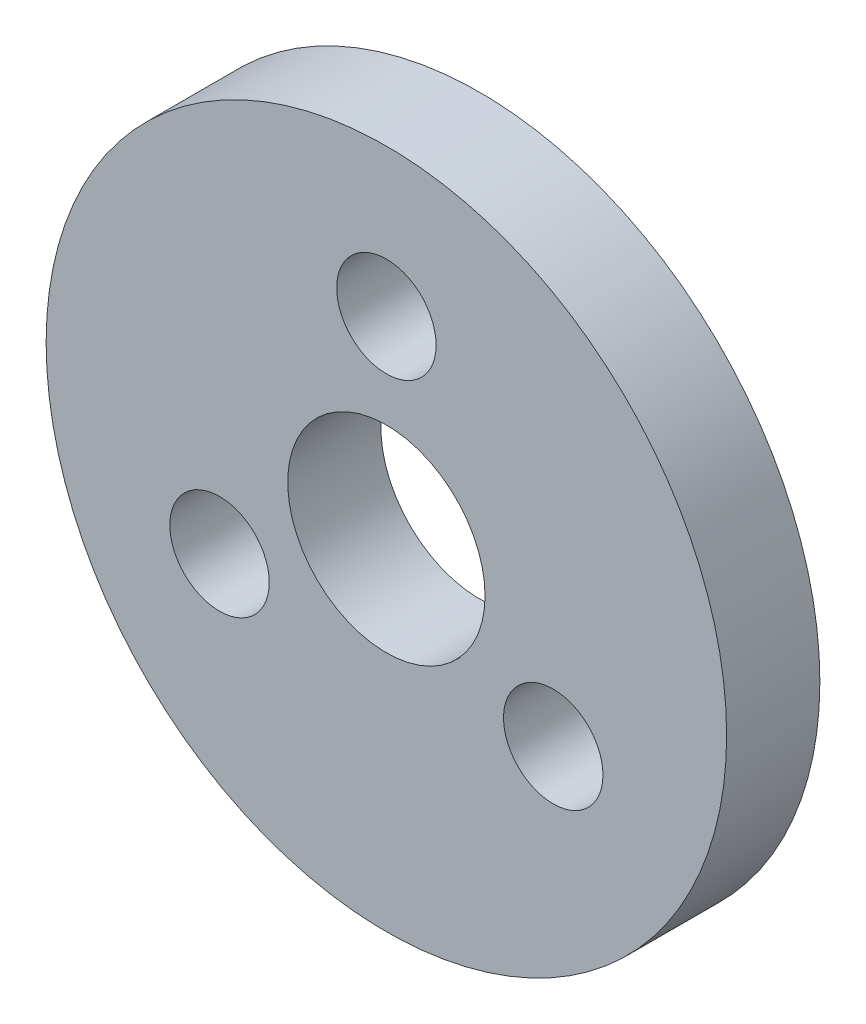
ISO-10303-21;
HEADER;
FILE_DESCRIPTION(('STEP AP214'),'2;1');
FILE_NAME('part.step','',(''),(''),'','','');
FILE_SCHEMA(('AUTOMOTIVE_DESIGN { 1 0 10303 214 1 1 1 1 }'));
ENDSEC;
DATA;
#1=APPLICATION_CONTEXT('core data for automotive mechanical design processes');
#2=APPLICATION_PROTOCOL_DEFINITION('international standard','automotive_design',2000,#1);
#3=PRODUCT_CONTEXT('',#1,'mechanical');
#4=PRODUCT('Part','Part','',(#3));
#5=PRODUCT_RELATED_PRODUCT_CATEGORY('part','',(#4));
#6=PRODUCT_DEFINITION_FORMATION('','',#4);
#7=PRODUCT_DEFINITION_CONTEXT('part definition',#1,'design');
#8=PRODUCT_DEFINITION('design','',#6,#7);
#9=PRODUCT_DEFINITION_SHAPE('','',#8);
#10=(LENGTH_UNIT() NAMED_UNIT(*) SI_UNIT(.MILLI.,.METRE.));
#11=(NAMED_UNIT(*) PLANE_ANGLE_UNIT() SI_UNIT($,.RADIAN.));
#12=(NAMED_UNIT(*) SI_UNIT($,.STERADIAN.) SOLID_ANGLE_UNIT());
#13=UNCERTAINTY_MEASURE_WITH_UNIT(LENGTH_MEASURE(1.E-05),#10,'distance_accuracy_value','');
#14=(GEOMETRIC_REPRESENTATION_CONTEXT(3) GLOBAL_UNCERTAINTY_ASSIGNED_CONTEXT((#13)) GLOBAL_UNIT_ASSIGNED_CONTEXT((#10,
#11,#12)) REPRESENTATION_CONTEXT('',''));
#15=CARTESIAN_POINT('',(0.,0.,0.));
#16=DIRECTION('',(0.,0.,1.));
#17=DIRECTION('',(1.,0.,0.));
#18=AXIS2_PLACEMENT_3D('',#15,#16,#17);
#19=CARTESIAN_POINT('',(0.,0.,3.));
#20=DIRECTION('',(0.,0.,1.));
#21=DIRECTION('',(1.,0.,0.));
#22=AXIS2_PLACEMENT_3D('',#19,#20,#21);
#23=PLANE('',#22);
#24=CARTESIAN_POINT('',(0.,6.2,3.));
#25=DIRECTION('',(0.,0.,1.));
#26=DIRECTION('',(1.,0.,0.));
#27=AXIS2_PLACEMENT_3D('',#24,#25,#26);
#28=CIRCLE('',#27,1.6);
#29=CARTESIAN_POINT('',(1.6,6.2,3.));
#30=VERTEX_POINT('',#29);
#31=EDGE_CURVE('E63',#30,#30,#28,.T.);
#32=ORIENTED_EDGE('',*,*,#31,.F.);
#33=EDGE_LOOP('',(#32));
#34=FACE_BOUND('',#33,.T.);
#35=CARTESIAN_POINT('',(-5.36935750346352,-3.1,3.));
#36=DIRECTION('',(0.,0.,1.));
#37=DIRECTION('',(1.,0.,0.));
#38=AXIS2_PLACEMENT_3D('',#35,#36,#37);
#39=CIRCLE('',#38,1.6);
#40=CARTESIAN_POINT('',(-3.76935750346352,-3.1,3.));
#41=VERTEX_POINT('',#40);
#42=EDGE_CURVE('E57',#41,#41,#39,.T.);
#43=ORIENTED_EDGE('',*,*,#42,.F.);
#44=EDGE_LOOP('',(#43));
#45=FACE_BOUND('',#44,.T.);
#46=CARTESIAN_POINT('',(5.36935750346353,-3.1,3.));
#47=DIRECTION('',(0.,0.,1.));
#48=DIRECTION('',(1.,0.,0.));
#49=AXIS2_PLACEMENT_3D('',#46,#47,#48);
#50=CIRCLE('',#49,1.6);
#51=CARTESIAN_POINT('',(6.96935750346353,-3.1,3.));
#52=VERTEX_POINT('',#51);
#53=EDGE_CURVE('E51',#52,#52,#50,.T.);
#54=ORIENTED_EDGE('',*,*,#53,.F.);
#55=EDGE_LOOP('',(#54));
#56=FACE_BOUND('',#55,.T.);
#57=CARTESIAN_POINT('',(0.,0.,3.));
#58=DIRECTION('',(0.,0.,1.));
#59=DIRECTION('',(1.,0.,0.));
#60=AXIS2_PLACEMENT_3D('',#57,#58,#59);
#61=CIRCLE('',#60,10.95);
#62=CARTESIAN_POINT('',(10.95,0.,3.));
#63=VERTEX_POINT('',#62);
#64=EDGE_CURVE('E10',#63,#63,#61,.T.);
#65=ORIENTED_EDGE('',*,*,#64,.T.);
#66=EDGE_LOOP('',(#65));
#67=FACE_BOUND('',#66,.T.);
#68=CARTESIAN_POINT('',(0.,0.,3.));
#69=DIRECTION('',(0.,0.,1.));
#70=DIRECTION('',(1.,0.,0.));
#71=AXIS2_PLACEMENT_3D('',#68,#69,#70);
#72=CIRCLE('',#71,3.175);
#73=CARTESIAN_POINT('',(3.175,0.,3.));
#74=VERTEX_POINT('',#73);
#75=EDGE_CURVE('E41',#74,#74,#72,.T.);
#76=ORIENTED_EDGE('',*,*,#75,.F.);
#77=EDGE_LOOP('',(#76));
#78=FACE_BOUND('',#77,.T.);
#79=ADVANCED_FACE('F30',(#34,#45,#56,#67,#78),#23,.T.);
#80=CARTESIAN_POINT('',(0.,0.,0.));
#81=DIRECTION('',(0.,0.,1.));
#82=DIRECTION('',(1.,0.,0.));
#83=AXIS2_PLACEMENT_3D('',#80,#81,#82);
#84=PLANE('',#83);
#85=CARTESIAN_POINT('',(0.,6.2,0.));
#86=DIRECTION('',(0.,0.,1.));
#87=DIRECTION('',(1.,0.,0.));
#88=AXIS2_PLACEMENT_3D('',#85,#86,#87);
#89=CIRCLE('',#88,1.6);
#90=CARTESIAN_POINT('',(1.6,6.2,0.));
#91=VERTEX_POINT('',#90);
#92=EDGE_CURVE('E60',#91,#91,#89,.T.);
#93=ORIENTED_EDGE('',*,*,#92,.T.);
#94=EDGE_LOOP('',(#93));
#95=FACE_BOUND('',#94,.T.);
#96=CARTESIAN_POINT('',(-5.36935750346352,-3.1,0.));
#97=DIRECTION('',(0.,0.,1.));
#98=DIRECTION('',(1.,0.,0.));
#99=AXIS2_PLACEMENT_3D('',#96,#97,#98);
#100=CIRCLE('',#99,1.6);
#101=CARTESIAN_POINT('',(-3.76935750346352,-3.1,0.));
#102=VERTEX_POINT('',#101);
#103=EDGE_CURVE('E54',#102,#102,#100,.T.);
#104=ORIENTED_EDGE('',*,*,#103,.T.);
#105=EDGE_LOOP('',(#104));
#106=FACE_BOUND('',#105,.T.);
#107=CARTESIAN_POINT('',(5.36935750346353,-3.1,0.));
#108=DIRECTION('',(0.,0.,1.));
#109=DIRECTION('',(1.,0.,0.));
#110=AXIS2_PLACEMENT_3D('',#107,#108,#109);
#111=CIRCLE('',#110,1.6);
#112=CARTESIAN_POINT('',(6.96935750346353,-3.1,0.));
#113=VERTEX_POINT('',#112);
#114=EDGE_CURVE('E46',#113,#113,#111,.T.);
#115=ORIENTED_EDGE('',*,*,#114,.T.);
#116=EDGE_LOOP('',(#115));
#117=FACE_BOUND('',#116,.T.);
#118=CARTESIAN_POINT('',(0.,0.,0.));
#119=DIRECTION('',(0.,0.,1.));
#120=DIRECTION('',(1.,0.,0.));
#121=AXIS2_PLACEMENT_3D('',#118,#119,#120);
#122=CIRCLE('',#121,10.95);
#123=CARTESIAN_POINT('',(10.95,0.,0.));
#124=VERTEX_POINT('',#123);
#125=EDGE_CURVE('E34',#124,#124,#122,.T.);
#126=ORIENTED_EDGE('',*,*,#125,.F.);
#127=EDGE_LOOP('',(#126));
#128=FACE_BOUND('',#127,.T.);
#129=CARTESIAN_POINT('',(0.,0.,0.));
#130=DIRECTION('',(0.,0.,1.));
#131=DIRECTION('',(1.,0.,0.));
#132=AXIS2_PLACEMENT_3D('',#129,#130,#131);
#133=CIRCLE('',#132,3.175);
#134=CARTESIAN_POINT('',(3.175,0.,0.));
#135=VERTEX_POINT('',#134);
#136=EDGE_CURVE('E43',#135,#135,#133,.T.);
#137=ORIENTED_EDGE('',*,*,#136,.T.);
#138=EDGE_LOOP('',(#137));
#139=FACE_BOUND('',#138,.T.);
#140=ADVANCED_FACE('F71',(#95,#106,#117,#128,#139),#84,.F.);
#141=CARTESIAN_POINT('',(0.,0.,3.));
#142=DIRECTION('',(0.,0.,-1.));
#143=DIRECTION('',(-1.,0.,0.));
#144=AXIS2_PLACEMENT_3D('',#141,#142,#143);
#145=CYLINDRICAL_SURFACE('',#144,10.95);
#146=ORIENTED_EDGE('',*,*,#64,.F.);
#147=EDGE_LOOP('',(#146));
#148=FACE_BOUND('',#147,.T.);
#149=ORIENTED_EDGE('',*,*,#125,.T.);
#150=EDGE_LOOP('',(#149));
#151=FACE_BOUND('',#150,.T.);
#152=ADVANCED_FACE('F32',(#148,#151),#145,.T.);
#153=CARTESIAN_POINT('',(0.,0.,3.));
#154=DIRECTION('',(0.,0.,-1.));
#155=DIRECTION('',(-1.,0.,0.));
#156=AXIS2_PLACEMENT_3D('',#153,#154,#155);
#157=CYLINDRICAL_SURFACE('',#156,3.175);
#158=ORIENTED_EDGE('',*,*,#75,.T.);
#159=EDGE_LOOP('',(#158));
#160=FACE_BOUND('',#159,.T.);
#161=ORIENTED_EDGE('',*,*,#136,.F.);
#162=EDGE_LOOP('',(#161));
#163=FACE_BOUND('',#162,.T.);
#164=ADVANCED_FACE('F79',(#160,#163),#157,.F.);
#165=CARTESIAN_POINT('',(5.36935750346353,-3.1,3.));
#166=DIRECTION('',(0.,0.,1.));
#167=DIRECTION('',(1.,0.,0.));
#168=AXIS2_PLACEMENT_3D('',#165,#166,#167);
#169=CYLINDRICAL_SURFACE('',#168,1.6);
#170=ORIENTED_EDGE('',*,*,#114,.F.);
#171=EDGE_LOOP('',(#170));
#172=FACE_BOUND('',#171,.T.);
#173=ORIENTED_EDGE('',*,*,#53,.T.);
#174=EDGE_LOOP('',(#173));
#175=FACE_BOUND('',#174,.T.);
#176=ADVANCED_FACE('F82',(#172,#175),#169,.F.);
#177=CARTESIAN_POINT('',(-5.36935750346352,-3.1,3.));
#178=DIRECTION('',(0.,0.,1.));
#179=DIRECTION('',(1.,0.,0.));
#180=AXIS2_PLACEMENT_3D('',#177,#178,#179);
#181=CYLINDRICAL_SURFACE('',#180,1.6);
#182=ORIENTED_EDGE('',*,*,#103,.F.);
#183=EDGE_LOOP('',(#182));
#184=FACE_BOUND('',#183,.T.);
#185=ORIENTED_EDGE('',*,*,#42,.T.);
#186=EDGE_LOOP('',(#185));
#187=FACE_BOUND('',#186,.T.);
#188=ADVANCED_FACE('F96',(#184,#187),#181,.F.);
#189=CARTESIAN_POINT('',(0.,6.2,3.));
#190=DIRECTION('',(0.,0.,1.));
#191=DIRECTION('',(1.,0.,0.));
#192=AXIS2_PLACEMENT_3D('',#189,#190,#191);
#193=CYLINDRICAL_SURFACE('',#192,1.6);
#194=ORIENTED_EDGE('',*,*,#92,.F.);
#195=EDGE_LOOP('',(#194));
#196=FACE_BOUND('',#195,.T.);
#197=ORIENTED_EDGE('',*,*,#31,.T.);
#198=EDGE_LOOP('',(#197));
#199=FACE_BOUND('',#198,.T.);
#200=ADVANCED_FACE('F67',(#196,#199),#193,.F.);
#201=CLOSED_SHELL('',(#79,#140,#152,#164,#176,#188,#200));
#202=MANIFOLD_SOLID_BREP('B2',#201);
#203=ADVANCED_BREP_SHAPE_REPRESENTATION('',(#18,#202),#14);
#204=SHAPE_DEFINITION_REPRESENTATION(#9,#203);
ENDSEC;
END-ISO-10303-21;
